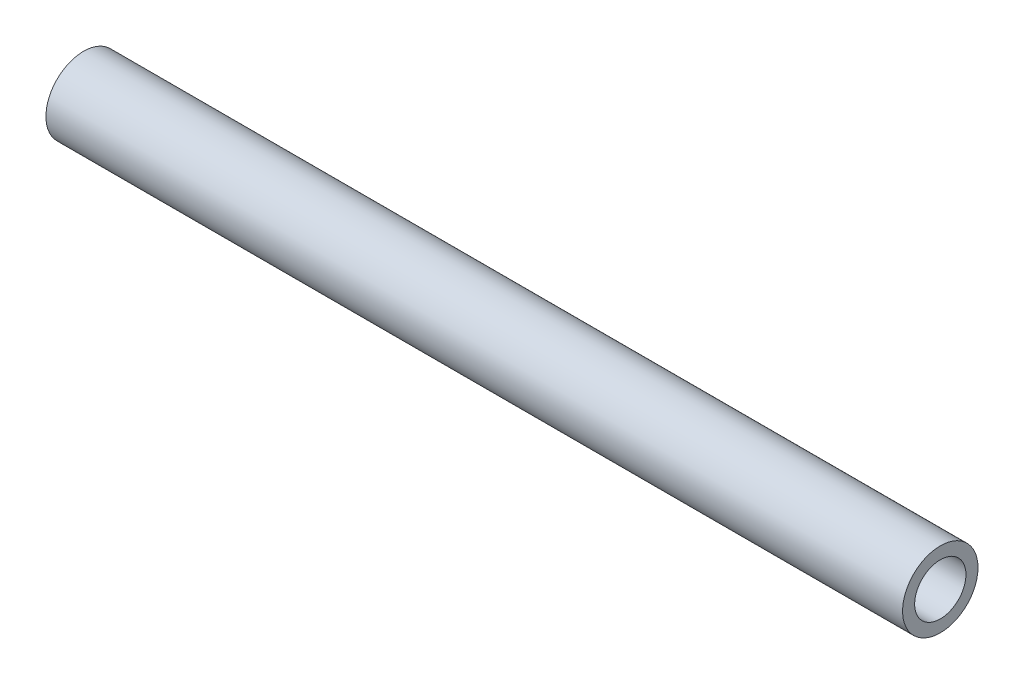
ISO-10303-21;
HEADER;
FILE_DESCRIPTION(('STEP AP214'),'2;1');
FILE_NAME('part.step','',(''),(''),'','','');
FILE_SCHEMA(('AUTOMOTIVE_DESIGN { 1 0 10303 214 1 1 1 1 }'));
ENDSEC;
DATA;
#1=APPLICATION_CONTEXT('core data for automotive mechanical design processes');
#2=APPLICATION_PROTOCOL_DEFINITION('international standard','automotive_design',2000,#1);
#3=PRODUCT_CONTEXT('',#1,'mechanical');
#4=PRODUCT('Part','Part','',(#3));
#5=PRODUCT_RELATED_PRODUCT_CATEGORY('part','',(#4));
#6=PRODUCT_DEFINITION_FORMATION('','',#4);
#7=PRODUCT_DEFINITION_CONTEXT('part definition',#1,'design');
#8=PRODUCT_DEFINITION('design','',#6,#7);
#9=PRODUCT_DEFINITION_SHAPE('','',#8);
#10=(LENGTH_UNIT() NAMED_UNIT(*) SI_UNIT(.MILLI.,.METRE.));
#11=(NAMED_UNIT(*) PLANE_ANGLE_UNIT() SI_UNIT($,.RADIAN.));
#12=(NAMED_UNIT(*) SI_UNIT($,.STERADIAN.) SOLID_ANGLE_UNIT());
#13=UNCERTAINTY_MEASURE_WITH_UNIT(LENGTH_MEASURE(1.E-05),#10,'distance_accuracy_value','');
#14=(GEOMETRIC_REPRESENTATION_CONTEXT(3) GLOBAL_UNCERTAINTY_ASSIGNED_CONTEXT((#13)) GLOBAL_UNIT_ASSIGNED_CONTEXT((#10,
#11,#12)) REPRESENTATION_CONTEXT('',''));
#15=CARTESIAN_POINT('',(0.,0.,0.));
#16=DIRECTION('',(0.,0.,1.));
#17=DIRECTION('',(1.,0.,0.));
#18=AXIS2_PLACEMENT_3D('',#15,#16,#17);
#19=CARTESIAN_POINT('',(142.,0.,0.));
#20=DIRECTION('',(1.,0.,0.));
#21=DIRECTION('',(0.,0.,-1.));
#22=AXIS2_PLACEMENT_3D('',#19,#20,#21);
#23=PLANE('',#22);
#24=CARTESIAN_POINT('',(142.,0.,0.));
#25=DIRECTION('',(1.,0.,0.));
#26=DIRECTION('',(0.,0.,-1.));
#27=AXIS2_PLACEMENT_3D('',#24,#25,#26);
#28=CIRCLE('',#27,6.25);
#29=CARTESIAN_POINT('',(142.,0.,-6.25));
#30=VERTEX_POINT('',#29);
#31=EDGE_CURVE('E10',#30,#30,#28,.T.);
#32=ORIENTED_EDGE('',*,*,#31,.T.);
#33=EDGE_LOOP('',(#32));
#34=FACE_BOUND('',#33,.T.);
#35=CARTESIAN_POINT('',(142.,0.,0.));
#36=DIRECTION('',(1.,0.,0.));
#37=DIRECTION('',(0.,0.,-1.));
#38=AXIS2_PLACEMENT_3D('',#35,#36,#37);
#39=CIRCLE('',#38,4.25);
#40=CARTESIAN_POINT('',(142.,0.,-4.25));
#41=VERTEX_POINT('',#40);
#42=EDGE_CURVE('E54',#41,#41,#39,.T.);
#43=ORIENTED_EDGE('',*,*,#42,.F.);
#44=EDGE_LOOP('',(#43));
#45=FACE_BOUND('',#44,.T.);
#46=ADVANCED_FACE('F40',(#34,#45),#23,.T.);
#47=CARTESIAN_POINT('',(0.,0.,0.));
#48=DIRECTION('',(1.,0.,0.));
#49=DIRECTION('',(0.,0.,-1.));
#50=AXIS2_PLACEMENT_3D('',#47,#48,#49);
#51=PLANE('',#50);
#52=CARTESIAN_POINT('',(0.,0.,0.));
#53=DIRECTION('',(1.,0.,0.));
#54=DIRECTION('',(0.,0.,-1.));
#55=AXIS2_PLACEMENT_3D('',#52,#53,#54);
#56=CIRCLE('',#55,6.25);
#57=CARTESIAN_POINT('',(0.,0.,-6.25));
#58=VERTEX_POINT('',#57);
#59=EDGE_CURVE('E44',#58,#58,#56,.T.);
#60=ORIENTED_EDGE('',*,*,#59,.F.);
#61=EDGE_LOOP('',(#60));
#62=FACE_BOUND('',#61,.T.);
#63=CARTESIAN_POINT('',(0.,0.,0.));
#64=DIRECTION('',(1.,0.,0.));
#65=DIRECTION('',(0.,0.,-1.));
#66=AXIS2_PLACEMENT_3D('',#63,#64,#65);
#67=CIRCLE('',#66,4.25);
#68=CARTESIAN_POINT('',(0.,0.,-4.25));
#69=VERTEX_POINT('',#68);
#70=EDGE_CURVE('E56',#69,#69,#67,.T.);
#71=ORIENTED_EDGE('',*,*,#70,.T.);
#72=EDGE_LOOP('',(#71));
#73=FACE_BOUND('',#72,.T.);
#74=ADVANCED_FACE('F67',(#62,#73),#51,.F.);
#75=CARTESIAN_POINT('',(142.,0.,0.));
#76=DIRECTION('',(-1.,0.,0.));
#77=DIRECTION('',(0.,0.,1.));
#78=AXIS2_PLACEMENT_3D('',#75,#76,#77);
#79=CYLINDRICAL_SURFACE('',#78,6.25);
#80=ORIENTED_EDGE('',*,*,#31,.F.);
#81=EDGE_LOOP('',(#80));
#82=FACE_BOUND('',#81,.T.);
#83=ORIENTED_EDGE('',*,*,#59,.T.);
#84=EDGE_LOOP('',(#83));
#85=FACE_BOUND('',#84,.T.);
#86=ADVANCED_FACE('F42',(#82,#85),#79,.T.);
#87=CARTESIAN_POINT('',(142.,0.,0.));
#88=DIRECTION('',(-1.,0.,0.));
#89=DIRECTION('',(0.,0.,1.));
#90=AXIS2_PLACEMENT_3D('',#87,#88,#89);
#91=CYLINDRICAL_SURFACE('',#90,4.25);
#92=ORIENTED_EDGE('',*,*,#42,.T.);
#93=EDGE_LOOP('',(#92));
#94=FACE_BOUND('',#93,.T.);
#95=ORIENTED_EDGE('',*,*,#70,.F.);
#96=EDGE_LOOP('',(#95));
#97=FACE_BOUND('',#96,.T.);
#98=ADVANCED_FACE('F63',(#94,#97),#91,.F.);
#99=CLOSED_SHELL('',(#46,#74,#86,#98));
#100=MANIFOLD_SOLID_BREP('B2',#99);
#101=ADVANCED_BREP_SHAPE_REPRESENTATION('',(#18,#100),#14);
#102=SHAPE_DEFINITION_REPRESENTATION(#9,#101);
ENDSEC;
END-ISO-10303-21;
